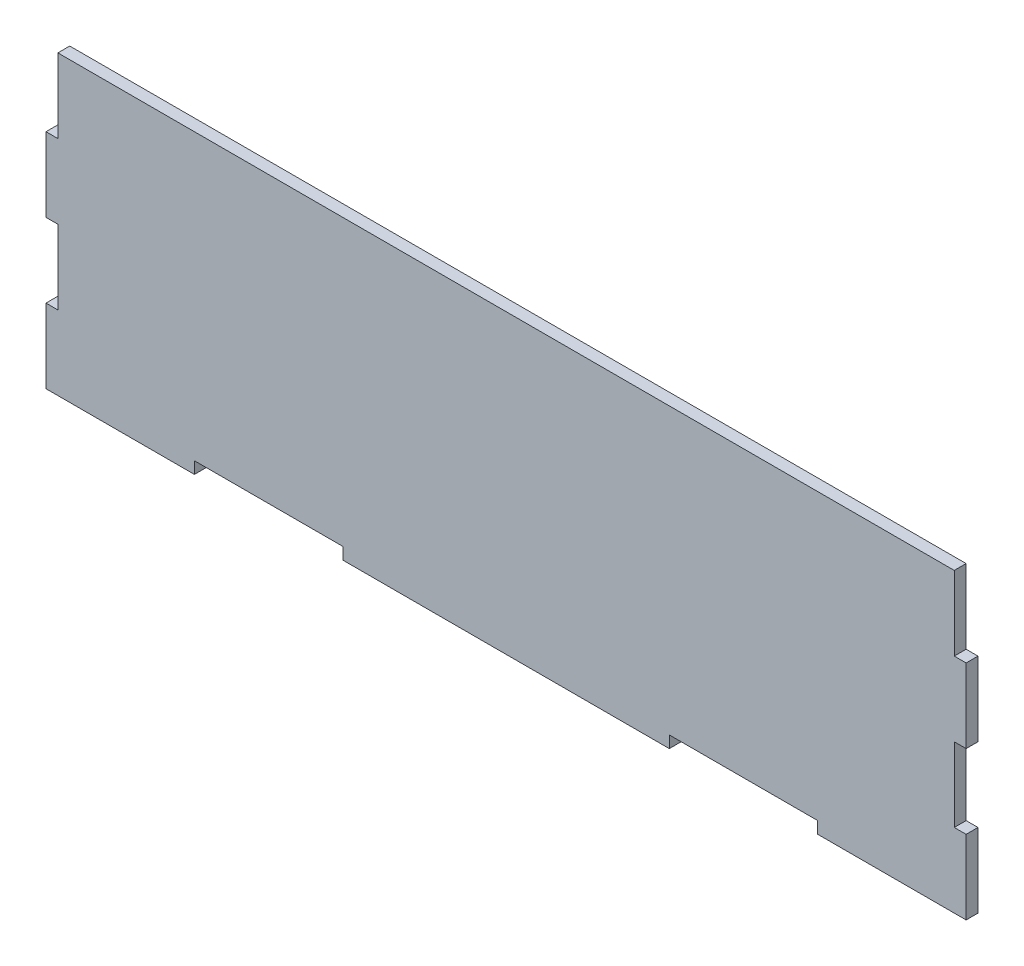
ISO-10303-21;
HEADER;
FILE_DESCRIPTION(('STEP AP214'),'2;1');
FILE_NAME('part.step','',(''),(''),'','','');
FILE_SCHEMA(('AUTOMOTIVE_DESIGN { 1 0 10303 214 1 1 1 1 }'));
ENDSEC;
DATA;
#1=APPLICATION_CONTEXT('core data for automotive mechanical design processes');
#2=APPLICATION_PROTOCOL_DEFINITION('international standard','automotive_design',2000,#1);
#3=PRODUCT_CONTEXT('',#1,'mechanical');
#4=PRODUCT('Part','Part','',(#3));
#5=PRODUCT_RELATED_PRODUCT_CATEGORY('part','',(#4));
#6=PRODUCT_DEFINITION_FORMATION('','',#4);
#7=PRODUCT_DEFINITION_CONTEXT('part definition',#1,'design');
#8=PRODUCT_DEFINITION('design','',#6,#7);
#9=PRODUCT_DEFINITION_SHAPE('','',#8);
#10=(LENGTH_UNIT() NAMED_UNIT(*) SI_UNIT(.MILLI.,.METRE.));
#11=(NAMED_UNIT(*) PLANE_ANGLE_UNIT() SI_UNIT($,.RADIAN.));
#12=(NAMED_UNIT(*) SI_UNIT($,.STERADIAN.) SOLID_ANGLE_UNIT());
#13=UNCERTAINTY_MEASURE_WITH_UNIT(LENGTH_MEASURE(1.E-05),#10,'distance_accuracy_value','');
#14=(GEOMETRIC_REPRESENTATION_CONTEXT(3) GLOBAL_UNCERTAINTY_ASSIGNED_CONTEXT((#13)) GLOBAL_UNIT_ASSIGNED_CONTEXT((#10,
#11,#12)) REPRESENTATION_CONTEXT('',''));
#15=CARTESIAN_POINT('',(0.,0.,0.));
#16=DIRECTION('',(0.,0.,1.));
#17=DIRECTION('',(1.,0.,0.));
#18=AXIS2_PLACEMENT_3D('',#15,#16,#17);
#19=CARTESIAN_POINT('',(155.,-50.,4.));
#20=DIRECTION('',(-1.,0.,0.));
#21=DIRECTION('',(0.,-1.,0.));
#22=AXIS2_PLACEMENT_3D('',#19,#20,#21);
#23=PLANE('',#22);
#24=DIRECTION('',(0.,1.,0.));
#25=VECTOR('',#24,1.);
#26=CARTESIAN_POINT('',(155.,-50.,0.));
#27=LINE('',#26,#25);
#28=CARTESIAN_POINT('',(155.,-50.,0.));
#29=VERTEX_POINT('',#28);
#30=CARTESIAN_POINT('',(155.,-25.,0.));
#31=VERTEX_POINT('',#30);
#32=EDGE_CURVE('E231',#29,#31,#27,.T.);
#33=ORIENTED_EDGE('',*,*,#32,.T.);
#34=DIRECTION('',(0.,0.,-1.));
#35=VECTOR('',#34,1.);
#36=CARTESIAN_POINT('',(155.,-25.,4.));
#37=LINE('',#36,#35);
#38=CARTESIAN_POINT('',(155.,-25.,4.));
#39=VERTEX_POINT('',#38);
#40=EDGE_CURVE('E11',#39,#31,#37,.T.);
#41=ORIENTED_EDGE('',*,*,#40,.F.);
#42=DIRECTION('',(0.,1.,0.));
#43=VECTOR('',#42,1.);
#44=CARTESIAN_POINT('',(155.,-50.,4.));
#45=LINE('',#44,#43);
#46=CARTESIAN_POINT('',(155.,-50.,4.));
#47=VERTEX_POINT('',#46);
#48=EDGE_CURVE('E277',#47,#39,#45,.T.);
#49=ORIENTED_EDGE('',*,*,#48,.F.);
#50=DIRECTION('',(0.,0.,-1.));
#51=VECTOR('',#50,1.);
#52=CARTESIAN_POINT('',(155.,-50.,4.));
#53=LINE('',#52,#51);
#54=EDGE_CURVE('E227',#47,#29,#53,.T.);
#55=ORIENTED_EDGE('',*,*,#54,.T.);
#56=EDGE_LOOP('',(#33,#41,#49,#55));
#57=FACE_BOUND('',#56,.T.);
#58=ADVANCED_FACE('F39',(#57),#23,.F.);
#59=CARTESIAN_POINT('',(155.,-25.,4.));
#60=DIRECTION('',(0.,-1.,0.));
#61=DIRECTION('',(1.,0.,0.));
#62=AXIS2_PLACEMENT_3D('',#59,#60,#61);
#63=PLANE('',#62);
#64=DIRECTION('',(-1.,0.,0.));
#65=VECTOR('',#64,1.);
#66=CARTESIAN_POINT('',(155.,-25.,0.));
#67=LINE('',#66,#65);
#68=CARTESIAN_POINT('',(151.,-25.,0.));
#69=VERTEX_POINT('',#68);
#70=EDGE_CURVE('E234',#31,#69,#67,.T.);
#71=ORIENTED_EDGE('',*,*,#70,.T.);
#72=DIRECTION('',(0.,0.,-1.));
#73=VECTOR('',#72,1.);
#74=CARTESIAN_POINT('',(151.,-25.,4.));
#75=LINE('',#74,#73);
#76=CARTESIAN_POINT('',(151.,-25.,4.));
#77=VERTEX_POINT('',#76);
#78=EDGE_CURVE('E47',#77,#69,#75,.T.);
#79=ORIENTED_EDGE('',*,*,#78,.F.);
#80=DIRECTION('',(-1.,0.,0.));
#81=VECTOR('',#80,1.);
#82=CARTESIAN_POINT('',(155.,-25.,4.));
#83=LINE('',#82,#81);
#84=EDGE_CURVE('E146',#39,#77,#83,.T.);
#85=ORIENTED_EDGE('',*,*,#84,.F.);
#86=ORIENTED_EDGE('',*,*,#40,.T.);
#87=EDGE_LOOP('',(#71,#79,#85,#86));
#88=FACE_BOUND('',#87,.T.);
#89=ADVANCED_FACE('F415',(#88),#63,.F.);
#90=CARTESIAN_POINT('',(151.,-25.,4.));
#91=DIRECTION('',(-1.,0.,0.));
#92=DIRECTION('',(0.,0.,1.));
#93=AXIS2_PLACEMENT_3D('',#90,#91,#92);
#94=PLANE('',#93);
#95=DIRECTION('',(0.,1.,0.));
#96=VECTOR('',#95,1.);
#97=CARTESIAN_POINT('',(151.,-25.,0.));
#98=LINE('',#97,#96);
#99=CARTESIAN_POINT('',(151.,0.,0.));
#100=VERTEX_POINT('',#99);
#101=EDGE_CURVE('E236',#69,#100,#98,.T.);
#102=ORIENTED_EDGE('',*,*,#101,.T.);
#103=DIRECTION('',(0.,0.,-1.));
#104=VECTOR('',#103,1.);
#105=CARTESIAN_POINT('',(151.,0.,4.));
#106=LINE('',#105,#104);
#107=CARTESIAN_POINT('',(151.,0.,4.));
#108=VERTEX_POINT('',#107);
#109=EDGE_CURVE('E332',#108,#100,#106,.T.);
#110=ORIENTED_EDGE('',*,*,#109,.F.);
#111=DIRECTION('',(0.,1.,0.));
#112=VECTOR('',#111,1.);
#113=CARTESIAN_POINT('',(151.,-25.,4.));
#114=LINE('',#113,#112);
#115=EDGE_CURVE('E340',#77,#108,#114,.T.);
#116=ORIENTED_EDGE('',*,*,#115,.F.);
#117=ORIENTED_EDGE('',*,*,#78,.T.);
#118=EDGE_LOOP('',(#102,#110,#116,#117));
#119=FACE_BOUND('',#118,.T.);
#120=ADVANCED_FACE('F338',(#119),#94,.F.);
#121=CARTESIAN_POINT('',(151.,0.,4.));
#122=DIRECTION('',(0.,1.,0.));
#123=DIRECTION('',(0.,0.,1.));
#124=AXIS2_PLACEMENT_3D('',#121,#122,#123);
#125=PLANE('',#124);
#126=DIRECTION('',(1.,0.,0.));
#127=VECTOR('',#126,1.);
#128=CARTESIAN_POINT('',(151.,0.,0.));
#129=LINE('',#128,#127);
#130=CARTESIAN_POINT('',(155.,0.,0.));
#131=VERTEX_POINT('',#130);
#132=EDGE_CURVE('E238',#100,#131,#129,.T.);
#133=ORIENTED_EDGE('',*,*,#132,.T.);
#134=DIRECTION('',(0.,0.,-1.));
#135=VECTOR('',#134,1.);
#136=CARTESIAN_POINT('',(155.,0.,4.));
#137=LINE('',#136,#135);
#138=CARTESIAN_POINT('',(155.,0.,4.));
#139=VERTEX_POINT('',#138);
#140=EDGE_CURVE('E329',#139,#131,#137,.T.);
#141=ORIENTED_EDGE('',*,*,#140,.F.);
#142=DIRECTION('',(1.,0.,0.));
#143=VECTOR('',#142,1.);
#144=CARTESIAN_POINT('',(151.,0.,4.));
#145=LINE('',#144,#143);
#146=EDGE_CURVE('E358',#108,#139,#145,.T.);
#147=ORIENTED_EDGE('',*,*,#146,.F.);
#148=ORIENTED_EDGE('',*,*,#109,.T.);
#149=EDGE_LOOP('',(#133,#141,#147,#148));
#150=FACE_BOUND('',#149,.T.);
#151=ADVANCED_FACE('F349',(#150),#125,.F.);
#152=CARTESIAN_POINT('',(155.,0.,4.));
#153=DIRECTION('',(-1.,0.,0.));
#154=DIRECTION('',(0.,-1.,0.));
#155=AXIS2_PLACEMENT_3D('',#152,#153,#154);
#156=PLANE('',#155);
#157=DIRECTION('',(0.,1.,0.));
#158=VECTOR('',#157,1.);
#159=CARTESIAN_POINT('',(155.,0.,0.));
#160=LINE('',#159,#158);
#161=CARTESIAN_POINT('',(155.,25.,0.));
#162=VERTEX_POINT('',#161);
#163=EDGE_CURVE('E240',#131,#162,#160,.T.);
#164=ORIENTED_EDGE('',*,*,#163,.T.);
#165=DIRECTION('',(0.,0.,-1.));
#166=VECTOR('',#165,1.);
#167=CARTESIAN_POINT('',(155.,25.,4.));
#168=LINE('',#167,#166);
#169=CARTESIAN_POINT('',(155.,25.,4.));
#170=VERTEX_POINT('',#169);
#171=EDGE_CURVE('E326',#170,#162,#168,.T.);
#172=ORIENTED_EDGE('',*,*,#171,.F.);
#173=DIRECTION('',(0.,1.,0.));
#174=VECTOR('',#173,1.);
#175=CARTESIAN_POINT('',(155.,0.,4.));
#176=LINE('',#175,#174);
#177=EDGE_CURVE('E355',#139,#170,#176,.T.);
#178=ORIENTED_EDGE('',*,*,#177,.F.);
#179=ORIENTED_EDGE('',*,*,#140,.T.);
#180=EDGE_LOOP('',(#164,#172,#178,#179));
#181=FACE_BOUND('',#180,.T.);
#182=ADVANCED_FACE('F353',(#181),#156,.F.);
#183=CARTESIAN_POINT('',(155.,25.,4.));
#184=DIRECTION('',(0.,-1.,0.));
#185=DIRECTION('',(1.,0.,0.));
#186=AXIS2_PLACEMENT_3D('',#183,#184,#185);
#187=PLANE('',#186);
#188=DIRECTION('',(-1.,0.,0.));
#189=VECTOR('',#188,1.);
#190=CARTESIAN_POINT('',(155.,25.,0.));
#191=LINE('',#190,#189);
#192=CARTESIAN_POINT('',(151.,25.,0.));
#193=VERTEX_POINT('',#192);
#194=EDGE_CURVE('E242',#162,#193,#191,.T.);
#195=ORIENTED_EDGE('',*,*,#194,.T.);
#196=DIRECTION('',(0.,0.,-1.));
#197=VECTOR('',#196,1.);
#198=CARTESIAN_POINT('',(151.,25.,4.));
#199=LINE('',#198,#197);
#200=CARTESIAN_POINT('',(151.,25.,4.));
#201=VERTEX_POINT('',#200);
#202=EDGE_CURVE('E323',#201,#193,#199,.T.);
#203=ORIENTED_EDGE('',*,*,#202,.F.);
#204=DIRECTION('',(-1.,0.,0.));
#205=VECTOR('',#204,1.);
#206=CARTESIAN_POINT('',(155.,25.,4.));
#207=LINE('',#206,#205);
#208=EDGE_CURVE('E357',#170,#201,#207,.T.);
#209=ORIENTED_EDGE('',*,*,#208,.F.);
#210=ORIENTED_EDGE('',*,*,#171,.T.);
#211=EDGE_LOOP('',(#195,#203,#209,#210));
#212=FACE_BOUND('',#211,.T.);
#213=ADVANCED_FACE('F428',(#212),#187,.F.);
#214=CARTESIAN_POINT('',(151.,25.,4.));
#215=DIRECTION('',(-1.,0.,0.));
#216=DIRECTION('',(0.,-1.,0.));
#217=AXIS2_PLACEMENT_3D('',#214,#215,#216);
#218=PLANE('',#217);
#219=DIRECTION('',(0.,1.,0.));
#220=VECTOR('',#219,1.);
#221=CARTESIAN_POINT('',(151.,25.,0.));
#222=LINE('',#221,#220);
#223=CARTESIAN_POINT('',(151.,50.,0.));
#224=VERTEX_POINT('',#223);
#225=EDGE_CURVE('E244',#193,#224,#222,.T.);
#226=ORIENTED_EDGE('',*,*,#225,.T.);
#227=DIRECTION('',(0.,0.,-1.));
#228=VECTOR('',#227,1.);
#229=CARTESIAN_POINT('',(151.,50.,4.));
#230=LINE('',#229,#228);
#231=CARTESIAN_POINT('',(151.,50.,4.));
#232=VERTEX_POINT('',#231);
#233=EDGE_CURVE('E320',#232,#224,#230,.T.);
#234=ORIENTED_EDGE('',*,*,#233,.F.);
#235=DIRECTION('',(0.,1.,0.));
#236=VECTOR('',#235,1.);
#237=CARTESIAN_POINT('',(151.,25.,4.));
#238=LINE('',#237,#236);
#239=EDGE_CURVE('E360',#201,#232,#238,.T.);
#240=ORIENTED_EDGE('',*,*,#239,.F.);
#241=ORIENTED_EDGE('',*,*,#202,.T.);
#242=EDGE_LOOP('',(#226,#234,#240,#241));
#243=FACE_BOUND('',#242,.T.);
#244=ADVANCED_FACE('F431',(#243),#218,.F.);
#245=CARTESIAN_POINT('',(151.,50.,4.));
#246=DIRECTION('',(0.,-1.,0.));
#247=DIRECTION('',(1.,0.,0.));
#248=AXIS2_PLACEMENT_3D('',#245,#246,#247);
#249=PLANE('',#248);
#250=DIRECTION('',(-1.,0.,0.));
#251=VECTOR('',#250,1.);
#252=CARTESIAN_POINT('',(151.,50.,0.));
#253=LINE('',#252,#251);
#254=CARTESIAN_POINT('',(-151.,50.,0.));
#255=VERTEX_POINT('',#254);
#256=EDGE_CURVE('E246',#224,#255,#253,.T.);
#257=ORIENTED_EDGE('',*,*,#256,.T.);
#258=DIRECTION('',(0.,0.,-1.));
#259=VECTOR('',#258,1.);
#260=CARTESIAN_POINT('',(-151.,50.,4.));
#261=LINE('',#260,#259);
#262=CARTESIAN_POINT('',(-151.,50.,4.));
#263=VERTEX_POINT('',#262);
#264=EDGE_CURVE('E317',#263,#255,#261,.T.);
#265=ORIENTED_EDGE('',*,*,#264,.F.);
#266=DIRECTION('',(-1.,0.,0.));
#267=VECTOR('',#266,1.);
#268=CARTESIAN_POINT('',(151.,50.,4.));
#269=LINE('',#268,#267);
#270=EDGE_CURVE('E366',#232,#263,#269,.T.);
#271=ORIENTED_EDGE('',*,*,#270,.F.);
#272=ORIENTED_EDGE('',*,*,#233,.T.);
#273=EDGE_LOOP('',(#257,#265,#271,#272));
#274=FACE_BOUND('',#273,.T.);
#275=ADVANCED_FACE('F435',(#274),#249,.F.);
#276=CARTESIAN_POINT('',(-151.,50.,4.));
#277=DIRECTION('',(1.,0.,0.));
#278=DIRECTION('',(0.,0.,-1.));
#279=AXIS2_PLACEMENT_3D('',#276,#277,#278);
#280=PLANE('',#279);
#281=DIRECTION('',(0.,-1.,0.));
#282=VECTOR('',#281,1.);
#283=CARTESIAN_POINT('',(-151.,50.,0.));
#284=LINE('',#283,#282);
#285=CARTESIAN_POINT('',(-151.,25.,0.));
#286=VERTEX_POINT('',#285);
#287=EDGE_CURVE('E248',#255,#286,#284,.T.);
#288=ORIENTED_EDGE('',*,*,#287,.T.);
#289=DIRECTION('',(0.,0.,-1.));
#290=VECTOR('',#289,1.);
#291=CARTESIAN_POINT('',(-151.,25.,4.));
#292=LINE('',#291,#290);
#293=CARTESIAN_POINT('',(-151.,25.,4.));
#294=VERTEX_POINT('',#293);
#295=EDGE_CURVE('E314',#294,#286,#292,.T.);
#296=ORIENTED_EDGE('',*,*,#295,.F.);
#297=DIRECTION('',(0.,-1.,0.));
#298=VECTOR('',#297,1.);
#299=CARTESIAN_POINT('',(-151.,50.,4.));
#300=LINE('',#299,#298);
#301=EDGE_CURVE('E368',#263,#294,#300,.T.);
#302=ORIENTED_EDGE('',*,*,#301,.F.);
#303=ORIENTED_EDGE('',*,*,#264,.T.);
#304=EDGE_LOOP('',(#288,#296,#302,#303));
#305=FACE_BOUND('',#304,.T.);
#306=ADVANCED_FACE('F439',(#305),#280,.F.);
#307=CARTESIAN_POINT('',(-151.,25.,4.));
#308=DIRECTION('',(0.,-1.,0.));
#309=DIRECTION('',(1.,0.,0.));
#310=AXIS2_PLACEMENT_3D('',#307,#308,#309);
#311=PLANE('',#310);
#312=DIRECTION('',(-1.,0.,0.));
#313=VECTOR('',#312,1.);
#314=CARTESIAN_POINT('',(-151.,25.,0.));
#315=LINE('',#314,#313);
#316=CARTESIAN_POINT('',(-155.,25.,0.));
#317=VERTEX_POINT('',#316);
#318=EDGE_CURVE('E250',#286,#317,#315,.T.);
#319=ORIENTED_EDGE('',*,*,#318,.T.);
#320=DIRECTION('',(0.,0.,-1.));
#321=VECTOR('',#320,1.);
#322=CARTESIAN_POINT('',(-155.,25.,4.));
#323=LINE('',#322,#321);
#324=CARTESIAN_POINT('',(-155.,25.,4.));
#325=VERTEX_POINT('',#324);
#326=EDGE_CURVE('E311',#325,#317,#323,.T.);
#327=ORIENTED_EDGE('',*,*,#326,.F.);
#328=DIRECTION('',(-1.,0.,0.));
#329=VECTOR('',#328,1.);
#330=CARTESIAN_POINT('',(-151.,25.,4.));
#331=LINE('',#330,#329);
#332=EDGE_CURVE('E370',#294,#325,#331,.T.);
#333=ORIENTED_EDGE('',*,*,#332,.F.);
#334=ORIENTED_EDGE('',*,*,#295,.T.);
#335=EDGE_LOOP('',(#319,#327,#333,#334));
#336=FACE_BOUND('',#335,.T.);
#337=ADVANCED_FACE('F443',(#336),#311,.F.);
#338=CARTESIAN_POINT('',(-155.,25.,4.));
#339=DIRECTION('',(1.,0.,0.));
#340=DIRECTION('',(0.,1.,0.));
#341=AXIS2_PLACEMENT_3D('',#338,#339,#340);
#342=PLANE('',#341);
#343=DIRECTION('',(0.,-1.,0.));
#344=VECTOR('',#343,1.);
#345=CARTESIAN_POINT('',(-155.,25.,0.));
#346=LINE('',#345,#344);
#347=CARTESIAN_POINT('',(-155.,0.,0.));
#348=VERTEX_POINT('',#347);
#349=EDGE_CURVE('E252',#317,#348,#346,.T.);
#350=ORIENTED_EDGE('',*,*,#349,.T.);
#351=DIRECTION('',(0.,0.,-1.));
#352=VECTOR('',#351,1.);
#353=CARTESIAN_POINT('',(-155.,0.,4.));
#354=LINE('',#353,#352);
#355=CARTESIAN_POINT('',(-155.,0.,4.));
#356=VERTEX_POINT('',#355);
#357=EDGE_CURVE('E308',#356,#348,#354,.T.);
#358=ORIENTED_EDGE('',*,*,#357,.F.);
#359=DIRECTION('',(0.,-1.,0.));
#360=VECTOR('',#359,1.);
#361=CARTESIAN_POINT('',(-155.,25.,4.));
#362=LINE('',#361,#360);
#363=EDGE_CURVE('E372',#325,#356,#362,.T.);
#364=ORIENTED_EDGE('',*,*,#363,.F.);
#365=ORIENTED_EDGE('',*,*,#326,.T.);
#366=EDGE_LOOP('',(#350,#358,#364,#365));
#367=FACE_BOUND('',#366,.T.);
#368=ADVANCED_FACE('F447',(#367),#342,.F.);
#369=CARTESIAN_POINT('',(-155.,0.,4.));
#370=DIRECTION('',(0.,1.,0.));
#371=DIRECTION('',(0.,0.,1.));
#372=AXIS2_PLACEMENT_3D('',#369,#370,#371);
#373=PLANE('',#372);
#374=DIRECTION('',(1.,0.,0.));
#375=VECTOR('',#374,1.);
#376=CARTESIAN_POINT('',(-155.,0.,0.));
#377=LINE('',#376,#375);
#378=CARTESIAN_POINT('',(-151.,0.,0.));
#379=VERTEX_POINT('',#378);
#380=EDGE_CURVE('E254',#348,#379,#377,.T.);
#381=ORIENTED_EDGE('',*,*,#380,.T.);
#382=DIRECTION('',(0.,0.,-1.));
#383=VECTOR('',#382,1.);
#384=CARTESIAN_POINT('',(-151.,0.,4.));
#385=LINE('',#384,#383);
#386=CARTESIAN_POINT('',(-151.,0.,4.));
#387=VERTEX_POINT('',#386);
#388=EDGE_CURVE('E305',#387,#379,#385,.T.);
#389=ORIENTED_EDGE('',*,*,#388,.F.);
#390=DIRECTION('',(1.,0.,0.));
#391=VECTOR('',#390,1.);
#392=CARTESIAN_POINT('',(-155.,0.,4.));
#393=LINE('',#392,#391);
#394=EDGE_CURVE('E374',#356,#387,#393,.T.);
#395=ORIENTED_EDGE('',*,*,#394,.F.);
#396=ORIENTED_EDGE('',*,*,#357,.T.);
#397=EDGE_LOOP('',(#381,#389,#395,#396));
#398=FACE_BOUND('',#397,.T.);
#399=ADVANCED_FACE('F451',(#398),#373,.F.);
#400=CARTESIAN_POINT('',(-151.,0.,4.));
#401=DIRECTION('',(1.,0.,0.));
#402=DIRECTION('',(0.,0.,-1.));
#403=AXIS2_PLACEMENT_3D('',#400,#401,#402);
#404=PLANE('',#403);
#405=DIRECTION('',(0.,-1.,0.));
#406=VECTOR('',#405,1.);
#407=CARTESIAN_POINT('',(-151.,0.,0.));
#408=LINE('',#407,#406);
#409=CARTESIAN_POINT('',(-151.,-25.,0.));
#410=VERTEX_POINT('',#409);
#411=EDGE_CURVE('E256',#379,#410,#408,.T.);
#412=ORIENTED_EDGE('',*,*,#411,.T.);
#413=DIRECTION('',(0.,0.,-1.));
#414=VECTOR('',#413,1.);
#415=CARTESIAN_POINT('',(-151.,-25.,4.));
#416=LINE('',#415,#414);
#417=CARTESIAN_POINT('',(-151.,-25.,4.));
#418=VERTEX_POINT('',#417);
#419=EDGE_CURVE('E302',#418,#410,#416,.T.);
#420=ORIENTED_EDGE('',*,*,#419,.F.);
#421=DIRECTION('',(0.,-1.,0.));
#422=VECTOR('',#421,1.);
#423=CARTESIAN_POINT('',(-151.,0.,4.));
#424=LINE('',#423,#422);
#425=EDGE_CURVE('E376',#387,#418,#424,.T.);
#426=ORIENTED_EDGE('',*,*,#425,.F.);
#427=ORIENTED_EDGE('',*,*,#388,.T.);
#428=EDGE_LOOP('',(#412,#420,#426,#427));
#429=FACE_BOUND('',#428,.T.);
#430=ADVANCED_FACE('F455',(#429),#404,.F.);
#431=CARTESIAN_POINT('',(-151.,-25.,4.));
#432=DIRECTION('',(0.,-1.,0.));
#433=DIRECTION('',(1.,0.,0.));
#434=AXIS2_PLACEMENT_3D('',#431,#432,#433);
#435=PLANE('',#434);
#436=DIRECTION('',(-1.,0.,0.));
#437=VECTOR('',#436,1.);
#438=CARTESIAN_POINT('',(-151.,-25.,0.));
#439=LINE('',#438,#437);
#440=CARTESIAN_POINT('',(-155.,-25.,0.));
#441=VERTEX_POINT('',#440);
#442=EDGE_CURVE('E258',#410,#441,#439,.T.);
#443=ORIENTED_EDGE('',*,*,#442,.T.);
#444=DIRECTION('',(0.,0.,-1.));
#445=VECTOR('',#444,1.);
#446=CARTESIAN_POINT('',(-155.,-25.,4.));
#447=LINE('',#446,#445);
#448=CARTESIAN_POINT('',(-155.,-25.,4.));
#449=VERTEX_POINT('',#448);
#450=EDGE_CURVE('E299',#449,#441,#447,.T.);
#451=ORIENTED_EDGE('',*,*,#450,.F.);
#452=DIRECTION('',(-1.,0.,0.));
#453=VECTOR('',#452,1.);
#454=CARTESIAN_POINT('',(-151.,-25.,4.));
#455=LINE('',#454,#453);
#456=EDGE_CURVE('E378',#418,#449,#455,.T.);
#457=ORIENTED_EDGE('',*,*,#456,.F.);
#458=ORIENTED_EDGE('',*,*,#419,.T.);
#459=EDGE_LOOP('',(#443,#451,#457,#458));
#460=FACE_BOUND('',#459,.T.);
#461=ADVANCED_FACE('F459',(#460),#435,.F.);
#462=CARTESIAN_POINT('',(-155.,-25.,4.));
#463=DIRECTION('',(1.,0.,0.));
#464=DIRECTION('',(0.,1.,0.));
#465=AXIS2_PLACEMENT_3D('',#462,#463,#464);
#466=PLANE('',#465);
#467=DIRECTION('',(0.,-1.,0.));
#468=VECTOR('',#467,1.);
#469=CARTESIAN_POINT('',(-155.,-25.,0.));
#470=LINE('',#469,#468);
#471=CARTESIAN_POINT('',(-155.,-50.,0.));
#472=VERTEX_POINT('',#471);
#473=EDGE_CURVE('E260',#441,#472,#470,.T.);
#474=ORIENTED_EDGE('',*,*,#473,.T.);
#475=DIRECTION('',(0.,0.,-1.));
#476=VECTOR('',#475,1.);
#477=CARTESIAN_POINT('',(-155.,-50.,4.));
#478=LINE('',#477,#476);
#479=CARTESIAN_POINT('',(-155.,-50.,4.));
#480=VERTEX_POINT('',#479);
#481=EDGE_CURVE('E296',#480,#472,#478,.T.);
#482=ORIENTED_EDGE('',*,*,#481,.F.);
#483=DIRECTION('',(0.,-1.,0.));
#484=VECTOR('',#483,1.);
#485=CARTESIAN_POINT('',(-155.,-25.,4.));
#486=LINE('',#485,#484);
#487=EDGE_CURVE('E380',#449,#480,#486,.T.);
#488=ORIENTED_EDGE('',*,*,#487,.F.);
#489=ORIENTED_EDGE('',*,*,#450,.T.);
#490=EDGE_LOOP('',(#474,#482,#488,#489));
#491=FACE_BOUND('',#490,.T.);
#492=ADVANCED_FACE('F463',(#491),#466,.F.);
#493=CARTESIAN_POINT('',(-155.,-50.,4.));
#494=DIRECTION('',(0.,1.,0.));
#495=DIRECTION('',(-1.,0.,0.));
#496=AXIS2_PLACEMENT_3D('',#493,#494,#495);
#497=PLANE('',#496);
#498=DIRECTION('',(1.,0.,0.));
#499=VECTOR('',#498,1.);
#500=CARTESIAN_POINT('',(-155.,-50.,0.));
#501=LINE('',#500,#499);
#502=CARTESIAN_POINT('',(-105.,-50.,0.));
#503=VERTEX_POINT('',#502);
#504=EDGE_CURVE('E262',#472,#503,#501,.T.);
#505=ORIENTED_EDGE('',*,*,#504,.T.);
#506=DIRECTION('',(0.,0.,-1.));
#507=VECTOR('',#506,1.);
#508=CARTESIAN_POINT('',(-105.,-50.,4.));
#509=LINE('',#508,#507);
#510=CARTESIAN_POINT('',(-105.,-50.,4.));
#511=VERTEX_POINT('',#510);
#512=EDGE_CURVE('E293',#511,#503,#509,.T.);
#513=ORIENTED_EDGE('',*,*,#512,.F.);
#514=DIRECTION('',(1.,0.,0.));
#515=VECTOR('',#514,1.);
#516=CARTESIAN_POINT('',(-155.,-50.,4.));
#517=LINE('',#516,#515);
#518=EDGE_CURVE('E382',#480,#511,#517,.T.);
#519=ORIENTED_EDGE('',*,*,#518,.F.);
#520=ORIENTED_EDGE('',*,*,#481,.T.);
#521=EDGE_LOOP('',(#505,#513,#519,#520));
#522=FACE_BOUND('',#521,.T.);
#523=ADVANCED_FACE('F467',(#522),#497,.F.);
#524=CARTESIAN_POINT('',(-105.,-50.,4.));
#525=DIRECTION('',(-1.,0.,0.));
#526=DIRECTION('',(0.,-1.,0.));
#527=AXIS2_PLACEMENT_3D('',#524,#525,#526);
#528=PLANE('',#527);
#529=DIRECTION('',(0.,1.,0.));
#530=VECTOR('',#529,1.);
#531=CARTESIAN_POINT('',(-105.,-50.,0.));
#532=LINE('',#531,#530);
#533=CARTESIAN_POINT('',(-105.,-46.,0.));
#534=VERTEX_POINT('',#533);
#535=EDGE_CURVE('E264',#503,#534,#532,.T.);
#536=ORIENTED_EDGE('',*,*,#535,.T.);
#537=DIRECTION('',(0.,0.,-1.));
#538=VECTOR('',#537,1.);
#539=CARTESIAN_POINT('',(-105.,-46.,4.));
#540=LINE('',#539,#538);
#541=CARTESIAN_POINT('',(-105.,-46.,4.));
#542=VERTEX_POINT('',#541);
#543=EDGE_CURVE('E290',#542,#534,#540,.T.);
#544=ORIENTED_EDGE('',*,*,#543,.F.);
#545=DIRECTION('',(0.,1.,0.));
#546=VECTOR('',#545,1.);
#547=CARTESIAN_POINT('',(-105.,-50.,4.));
#548=LINE('',#547,#546);
#549=EDGE_CURVE('E384',#511,#542,#548,.T.);
#550=ORIENTED_EDGE('',*,*,#549,.F.);
#551=ORIENTED_EDGE('',*,*,#512,.T.);
#552=EDGE_LOOP('',(#536,#544,#550,#551));
#553=FACE_BOUND('',#552,.T.);
#554=ADVANCED_FACE('F471',(#553),#528,.F.);
#555=CARTESIAN_POINT('',(-105.,-46.,4.));
#556=DIRECTION('',(0.,1.,0.));
#557=DIRECTION('',(0.,0.,1.));
#558=AXIS2_PLACEMENT_3D('',#555,#556,#557);
#559=PLANE('',#558);
#560=DIRECTION('',(1.,0.,0.));
#561=VECTOR('',#560,1.);
#562=CARTESIAN_POINT('',(-105.,-46.,0.));
#563=LINE('',#562,#561);
#564=CARTESIAN_POINT('',(-55.,-46.,0.));
#565=VERTEX_POINT('',#564);
#566=EDGE_CURVE('E266',#534,#565,#563,.T.);
#567=ORIENTED_EDGE('',*,*,#566,.T.);
#568=DIRECTION('',(0.,0.,-1.));
#569=VECTOR('',#568,1.);
#570=CARTESIAN_POINT('',(-55.,-46.,4.));
#571=LINE('',#570,#569);
#572=CARTESIAN_POINT('',(-55.,-46.,4.));
#573=VERTEX_POINT('',#572);
#574=EDGE_CURVE('E287',#573,#565,#571,.T.);
#575=ORIENTED_EDGE('',*,*,#574,.F.);
#576=DIRECTION('',(1.,0.,0.));
#577=VECTOR('',#576,1.);
#578=CARTESIAN_POINT('',(-105.,-46.,4.));
#579=LINE('',#578,#577);
#580=EDGE_CURVE('E386',#542,#573,#579,.T.);
#581=ORIENTED_EDGE('',*,*,#580,.F.);
#582=ORIENTED_EDGE('',*,*,#543,.T.);
#583=EDGE_LOOP('',(#567,#575,#581,#582));
#584=FACE_BOUND('',#583,.T.);
#585=ADVANCED_FACE('F475',(#584),#559,.F.);
#586=CARTESIAN_POINT('',(-55.,-46.,4.));
#587=DIRECTION('',(1.,0.,0.));
#588=DIRECTION('',(0.,1.,0.));
#589=AXIS2_PLACEMENT_3D('',#586,#587,#588);
#590=PLANE('',#589);
#591=DIRECTION('',(0.,-1.,0.));
#592=VECTOR('',#591,1.);
#593=CARTESIAN_POINT('',(-55.,-46.,0.));
#594=LINE('',#593,#592);
#595=CARTESIAN_POINT('',(-55.,-50.,0.));
#596=VERTEX_POINT('',#595);
#597=EDGE_CURVE('E268',#565,#596,#594,.T.);
#598=ORIENTED_EDGE('',*,*,#597,.T.);
#599=DIRECTION('',(0.,0.,-1.));
#600=VECTOR('',#599,1.);
#601=CARTESIAN_POINT('',(-55.,-50.,4.));
#602=LINE('',#601,#600);
#603=CARTESIAN_POINT('',(-55.,-50.,4.));
#604=VERTEX_POINT('',#603);
#605=EDGE_CURVE('E284',#604,#596,#602,.T.);
#606=ORIENTED_EDGE('',*,*,#605,.F.);
#607=DIRECTION('',(0.,-1.,0.));
#608=VECTOR('',#607,1.);
#609=CARTESIAN_POINT('',(-55.,-46.,4.));
#610=LINE('',#609,#608);
#611=EDGE_CURVE('E388',#573,#604,#610,.T.);
#612=ORIENTED_EDGE('',*,*,#611,.F.);
#613=ORIENTED_EDGE('',*,*,#574,.T.);
#614=EDGE_LOOP('',(#598,#606,#612,#613));
#615=FACE_BOUND('',#614,.T.);
#616=ADVANCED_FACE('F479',(#615),#590,.F.);
#617=CARTESIAN_POINT('',(-55.,-50.,4.));
#618=DIRECTION('',(0.,1.,0.));
#619=DIRECTION('',(-1.,0.,0.));
#620=AXIS2_PLACEMENT_3D('',#617,#618,#619);
#621=PLANE('',#620);
#622=DIRECTION('',(1.,0.,0.));
#623=VECTOR('',#622,1.);
#624=CARTESIAN_POINT('',(-55.,-50.,0.));
#625=LINE('',#624,#623);
#626=CARTESIAN_POINT('',(55.,-50.,0.));
#627=VERTEX_POINT('',#626);
#628=EDGE_CURVE('E270',#596,#627,#625,.T.);
#629=ORIENTED_EDGE('',*,*,#628,.T.);
#630=DIRECTION('',(0.,0.,-1.));
#631=VECTOR('',#630,1.);
#632=CARTESIAN_POINT('',(55.,-50.,4.));
#633=LINE('',#632,#631);
#634=CARTESIAN_POINT('',(55.,-50.,4.));
#635=VERTEX_POINT('',#634);
#636=EDGE_CURVE('E281',#635,#627,#633,.T.);
#637=ORIENTED_EDGE('',*,*,#636,.F.);
#638=DIRECTION('',(1.,0.,0.));
#639=VECTOR('',#638,1.);
#640=CARTESIAN_POINT('',(-55.,-50.,4.));
#641=LINE('',#640,#639);
#642=EDGE_CURVE('E390',#604,#635,#641,.T.);
#643=ORIENTED_EDGE('',*,*,#642,.F.);
#644=ORIENTED_EDGE('',*,*,#605,.T.);
#645=EDGE_LOOP('',(#629,#637,#643,#644));
#646=FACE_BOUND('',#645,.T.);
#647=ADVANCED_FACE('F396',(#646),#621,.F.);
#648=CARTESIAN_POINT('',(55.,-50.,4.));
#649=DIRECTION('',(-1.,0.,0.));
#650=DIRECTION('',(0.,0.,1.));
#651=AXIS2_PLACEMENT_3D('',#648,#649,#650);
#652=PLANE('',#651);
#653=DIRECTION('',(0.,1.,0.));
#654=VECTOR('',#653,1.);
#655=CARTESIAN_POINT('',(55.,-50.,0.));
#656=LINE('',#655,#654);
#657=CARTESIAN_POINT('',(55.,-46.,0.));
#658=VERTEX_POINT('',#657);
#659=EDGE_CURVE('E272',#627,#658,#656,.T.);
#660=ORIENTED_EDGE('',*,*,#659,.T.);
#661=DIRECTION('',(0.,0.,-1.));
#662=VECTOR('',#661,1.);
#663=CARTESIAN_POINT('',(55.,-46.,4.));
#664=LINE('',#663,#662);
#665=CARTESIAN_POINT('',(55.,-46.,4.));
#666=VERTEX_POINT('',#665);
#667=EDGE_CURVE('E222',#666,#658,#664,.T.);
#668=ORIENTED_EDGE('',*,*,#667,.F.);
#669=DIRECTION('',(0.,1.,0.));
#670=VECTOR('',#669,1.);
#671=CARTESIAN_POINT('',(55.,-50.,4.));
#672=LINE('',#671,#670);
#673=EDGE_CURVE('E213',#635,#666,#672,.T.);
#674=ORIENTED_EDGE('',*,*,#673,.F.);
#675=ORIENTED_EDGE('',*,*,#636,.T.);
#676=EDGE_LOOP('',(#660,#668,#674,#675));
#677=FACE_BOUND('',#676,.T.);
#678=ADVANCED_FACE('F400',(#677),#652,.F.);
#679=CARTESIAN_POINT('',(55.,-46.,4.));
#680=DIRECTION('',(0.,1.,0.));
#681=DIRECTION('',(0.,0.,1.));
#682=AXIS2_PLACEMENT_3D('',#679,#680,#681);
#683=PLANE('',#682);
#684=DIRECTION('',(1.,0.,0.));
#685=VECTOR('',#684,1.);
#686=CARTESIAN_POINT('',(55.,-46.,0.));
#687=LINE('',#686,#685);
#688=CARTESIAN_POINT('',(105.,-46.,0.));
#689=VERTEX_POINT('',#688);
#690=EDGE_CURVE('E221',#658,#689,#687,.T.);
#691=ORIENTED_EDGE('',*,*,#690,.T.);
#692=DIRECTION('',(0.,0.,-1.));
#693=VECTOR('',#692,1.);
#694=CARTESIAN_POINT('',(105.,-46.,4.));
#695=LINE('',#694,#693);
#696=CARTESIAN_POINT('',(105.,-46.,4.));
#697=VERTEX_POINT('',#696);
#698=EDGE_CURVE('E218',#697,#689,#695,.T.);
#699=ORIENTED_EDGE('',*,*,#698,.F.);
#700=DIRECTION('',(1.,0.,0.));
#701=VECTOR('',#700,1.);
#702=CARTESIAN_POINT('',(55.,-46.,4.));
#703=LINE('',#702,#701);
#704=EDGE_CURVE('E207',#666,#697,#703,.T.);
#705=ORIENTED_EDGE('',*,*,#704,.F.);
#706=ORIENTED_EDGE('',*,*,#667,.T.);
#707=EDGE_LOOP('',(#691,#699,#705,#706));
#708=FACE_BOUND('',#707,.T.);
#709=ADVANCED_FACE('F219',(#708),#683,.F.);
#710=CARTESIAN_POINT('',(105.,-46.,4.));
#711=DIRECTION('',(1.,0.,0.));
#712=DIRECTION('',(0.,0.,-1.));
#713=AXIS2_PLACEMENT_3D('',#710,#711,#712);
#714=PLANE('',#713);
#715=DIRECTION('',(0.,-1.,0.));
#716=VECTOR('',#715,1.);
#717=CARTESIAN_POINT('',(105.,-46.,0.));
#718=LINE('',#717,#716);
#719=CARTESIAN_POINT('',(105.,-50.,0.));
#720=VERTEX_POINT('',#719);
#721=EDGE_CURVE('E132',#689,#720,#718,.T.);
#722=ORIENTED_EDGE('',*,*,#721,.T.);
#723=DIRECTION('',(0.,0.,-1.));
#724=VECTOR('',#723,1.);
#725=CARTESIAN_POINT('',(105.,-50.,4.));
#726=LINE('',#725,#724);
#727=CARTESIAN_POINT('',(105.,-50.,4.));
#728=VERTEX_POINT('',#727);
#729=EDGE_CURVE('E223',#728,#720,#726,.T.);
#730=ORIENTED_EDGE('',*,*,#729,.F.);
#731=DIRECTION('',(0.,-1.,0.));
#732=VECTOR('',#731,1.);
#733=CARTESIAN_POINT('',(105.,-46.,4.));
#734=LINE('',#733,#732);
#735=EDGE_CURVE('E211',#697,#728,#734,.T.);
#736=ORIENTED_EDGE('',*,*,#735,.F.);
#737=ORIENTED_EDGE('',*,*,#698,.T.);
#738=EDGE_LOOP('',(#722,#730,#736,#737));
#739=FACE_BOUND('',#738,.T.);
#740=ADVANCED_FACE('F225',(#739),#714,.F.);
#741=CARTESIAN_POINT('',(105.,-50.,4.));
#742=DIRECTION('',(0.,1.,0.));
#743=DIRECTION('',(-1.,0.,0.));
#744=AXIS2_PLACEMENT_3D('',#741,#742,#743);
#745=PLANE('',#744);
#746=DIRECTION('',(1.,0.,0.));
#747=VECTOR('',#746,1.);
#748=CARTESIAN_POINT('',(105.,-50.,0.));
#749=LINE('',#748,#747);
#750=EDGE_CURVE('E138',#720,#29,#749,.T.);
#751=ORIENTED_EDGE('',*,*,#750,.T.);
#752=ORIENTED_EDGE('',*,*,#54,.F.);
#753=DIRECTION('',(1.,0.,0.));
#754=VECTOR('',#753,1.);
#755=CARTESIAN_POINT('',(105.,-50.,4.));
#756=LINE('',#755,#754);
#757=EDGE_CURVE('E55',#728,#47,#756,.T.);
#758=ORIENTED_EDGE('',*,*,#757,.F.);
#759=ORIENTED_EDGE('',*,*,#729,.T.);
#760=EDGE_LOOP('',(#751,#752,#758,#759));
#761=FACE_BOUND('',#760,.T.);
#762=ADVANCED_FACE('F404',(#761),#745,.F.);
#763=CARTESIAN_POINT('',(0.,0.,4.));
#764=DIRECTION('',(0.,0.,1.));
#765=DIRECTION('',(1.,0.,0.));
#766=AXIS2_PLACEMENT_3D('',#763,#764,#765);
#767=PLANE('',#766);
#768=ORIENTED_EDGE('',*,*,#48,.T.);
#769=ORIENTED_EDGE('',*,*,#84,.T.);
#770=ORIENTED_EDGE('',*,*,#115,.T.);
#771=ORIENTED_EDGE('',*,*,#146,.T.);
#772=ORIENTED_EDGE('',*,*,#177,.T.);
#773=ORIENTED_EDGE('',*,*,#208,.T.);
#774=ORIENTED_EDGE('',*,*,#239,.T.);
#775=ORIENTED_EDGE('',*,*,#270,.T.);
#776=ORIENTED_EDGE('',*,*,#301,.T.);
#777=ORIENTED_EDGE('',*,*,#332,.T.);
#778=ORIENTED_EDGE('',*,*,#363,.T.);
#779=ORIENTED_EDGE('',*,*,#394,.T.);
#780=ORIENTED_EDGE('',*,*,#425,.T.);
#781=ORIENTED_EDGE('',*,*,#456,.T.);
#782=ORIENTED_EDGE('',*,*,#487,.T.);
#783=ORIENTED_EDGE('',*,*,#518,.T.);
#784=ORIENTED_EDGE('',*,*,#549,.T.);
#785=ORIENTED_EDGE('',*,*,#580,.T.);
#786=ORIENTED_EDGE('',*,*,#611,.T.);
#787=ORIENTED_EDGE('',*,*,#642,.T.);
#788=ORIENTED_EDGE('',*,*,#673,.T.);
#789=ORIENTED_EDGE('',*,*,#704,.T.);
#790=ORIENTED_EDGE('',*,*,#735,.T.);
#791=ORIENTED_EDGE('',*,*,#757,.T.);
#792=EDGE_LOOP('',(#768,#769,#770,#771,#772,#773,#774,#775,#776,#777,#778,#779,#780,#781,#782,
#783,#784,#785,#786,#787,#788,#789,#790,#791));
#793=FACE_BOUND('',#792,.T.);
#794=ADVANCED_FACE('F209',(#793),#767,.T.);
#795=CARTESIAN_POINT('',(0.,0.,0.));
#796=DIRECTION('',(0.,0.,1.));
#797=DIRECTION('',(1.,0.,0.));
#798=AXIS2_PLACEMENT_3D('',#795,#796,#797);
#799=PLANE('',#798);
#800=ORIENTED_EDGE('',*,*,#32,.F.);
#801=ORIENTED_EDGE('',*,*,#750,.F.);
#802=ORIENTED_EDGE('',*,*,#721,.F.);
#803=ORIENTED_EDGE('',*,*,#690,.F.);
#804=ORIENTED_EDGE('',*,*,#659,.F.);
#805=ORIENTED_EDGE('',*,*,#628,.F.);
#806=ORIENTED_EDGE('',*,*,#597,.F.);
#807=ORIENTED_EDGE('',*,*,#566,.F.);
#808=ORIENTED_EDGE('',*,*,#535,.F.);
#809=ORIENTED_EDGE('',*,*,#504,.F.);
#810=ORIENTED_EDGE('',*,*,#473,.F.);
#811=ORIENTED_EDGE('',*,*,#442,.F.);
#812=ORIENTED_EDGE('',*,*,#411,.F.);
#813=ORIENTED_EDGE('',*,*,#380,.F.);
#814=ORIENTED_EDGE('',*,*,#349,.F.);
#815=ORIENTED_EDGE('',*,*,#318,.F.);
#816=ORIENTED_EDGE('',*,*,#287,.F.);
#817=ORIENTED_EDGE('',*,*,#256,.F.);
#818=ORIENTED_EDGE('',*,*,#225,.F.);
#819=ORIENTED_EDGE('',*,*,#194,.F.);
#820=ORIENTED_EDGE('',*,*,#163,.F.);
#821=ORIENTED_EDGE('',*,*,#132,.F.);
#822=ORIENTED_EDGE('',*,*,#101,.F.);
#823=ORIENTED_EDGE('',*,*,#70,.F.);
#824=EDGE_LOOP('',(#800,#801,#802,#803,#804,#805,#806,#807,#808,#809,#810,#811,#812,#813,#814,
#815,#816,#817,#818,#819,#820,#821,#822,#823));
#825=FACE_BOUND('',#824,.T.);
#826=ADVANCED_FACE('F344',(#825),#799,.F.);
#827=CLOSED_SHELL('',(#58,#89,#120,#151,#182,#213,#244,#275,#306,#337,#368,#399,#430,#461,#492,
#523,#554,#585,#616,#647,#678,#709,#740,#762,#794,#826));
#828=MANIFOLD_SOLID_BREP('B2',#827);
#829=ADVANCED_BREP_SHAPE_REPRESENTATION('',(#18,#828),#14);
#830=SHAPE_DEFINITION_REPRESENTATION(#9,#829);
ENDSEC;
END-ISO-10303-21;
